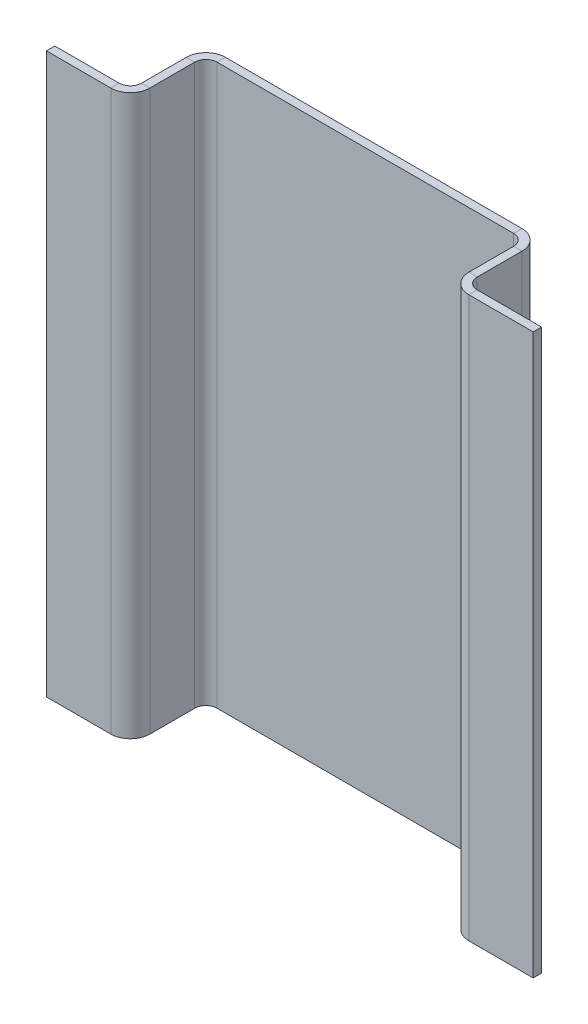
ISO-10303-21;
HEADER;
FILE_DESCRIPTION(('STEP AP214'),'2;1');
FILE_NAME('part.step','',(''),(''),'','','');
FILE_SCHEMA(('AUTOMOTIVE_DESIGN { 1 0 10303 214 1 1 1 1 }'));
ENDSEC;
DATA;
#1=APPLICATION_CONTEXT('core data for automotive mechanical design processes');
#2=APPLICATION_PROTOCOL_DEFINITION('international standard','automotive_design',2000,#1);
#3=PRODUCT_CONTEXT('',#1,'mechanical');
#4=PRODUCT('Part','Part','',(#3));
#5=PRODUCT_RELATED_PRODUCT_CATEGORY('part','',(#4));
#6=PRODUCT_DEFINITION_FORMATION('','',#4);
#7=PRODUCT_DEFINITION_CONTEXT('part definition',#1,'design');
#8=PRODUCT_DEFINITION('design','',#6,#7);
#9=PRODUCT_DEFINITION_SHAPE('','',#8);
#10=(LENGTH_UNIT() NAMED_UNIT(*) SI_UNIT(.MILLI.,.METRE.));
#11=(NAMED_UNIT(*) PLANE_ANGLE_UNIT() SI_UNIT($,.RADIAN.));
#12=(NAMED_UNIT(*) SI_UNIT($,.STERADIAN.) SOLID_ANGLE_UNIT());
#13=UNCERTAINTY_MEASURE_WITH_UNIT(LENGTH_MEASURE(1.E-05),#10,'distance_accuracy_value','');
#14=(GEOMETRIC_REPRESENTATION_CONTEXT(3) GLOBAL_UNCERTAINTY_ASSIGNED_CONTEXT((#13)) GLOBAL_UNIT_ASSIGNED_CONTEXT((#10,
#11,#12)) REPRESENTATION_CONTEXT('',''));
#15=CARTESIAN_POINT('',(0.,0.,0.));
#16=DIRECTION('',(0.,0.,1.));
#17=DIRECTION('',(1.,0.,0.));
#18=AXIS2_PLACEMENT_3D('',#15,#16,#17);
#19=CARTESIAN_POINT('',(30.,50.,13.5));
#20=DIRECTION('',(0.,-1.,0.));
#21=DIRECTION('',(1.,0.,0.));
#22=AXIS2_PLACEMENT_3D('',#19,#20,#21);
#23=PLANE('',#22);
#24=DIRECTION('',(-1.,0.,0.));
#25=VECTOR('',#24,1.);
#26=CARTESIAN_POINT('',(30.,50.,10.));
#27=LINE('',#26,#25);
#28=CARTESIAN_POINT('',(30.,50.,10.));
#29=VERTEX_POINT('',#28);
#30=CARTESIAN_POINT('',(28.5,50.,10.));
#31=VERTEX_POINT('',#30);
#32=EDGE_CURVE('E312',#29,#31,#27,.T.);
#33=ORIENTED_EDGE('',*,*,#32,.F.);
#34=DIRECTION('',(0.,0.,1.));
#35=VECTOR('',#34,1.);
#36=CARTESIAN_POINT('',(30.,50.,-1.13175571624599E-13));
#37=LINE('',#36,#35);
#38=CARTESIAN_POINT('',(30.,50.,1.99999999999999));
#39=VERTEX_POINT('',#38);
#40=EDGE_CURVE('E370',#39,#29,#37,.T.);
#41=ORIENTED_EDGE('',*,*,#40,.F.);
#42=DIRECTION('',(-1.,0.,0.));
#43=VECTOR('',#42,1.);
#44=CARTESIAN_POINT('',(28.5,50.,1.99999999999999));
#45=LINE('',#44,#43);
#46=CARTESIAN_POINT('',(28.5,50.,1.99999999999999));
#47=VERTEX_POINT('',#46);
#48=EDGE_CURVE('E381',#47,#39,#45,.F.);
#49=ORIENTED_EDGE('',*,*,#48,.F.);
#50=DIRECTION('',(0.,0.,-1.));
#51=VECTOR('',#50,1.);
#52=CARTESIAN_POINT('',(28.5,50.,13.5));
#53=LINE('',#52,#51);
#54=EDGE_CURVE('E375',#47,#31,#53,.F.);
#55=ORIENTED_EDGE('',*,*,#54,.T.);
#56=EDGE_LOOP('',(#33,#41,#49,#55));
#57=FACE_BOUND('',#56,.T.);
#58=ADVANCED_FACE('F115',(#57),#23,.F.);
#59=CARTESIAN_POINT('',(30.,-50.,0.));
#60=DIRECTION('',(0.,1.,0.));
#61=DIRECTION('',(-1.,0.,0.));
#62=AXIS2_PLACEMENT_3D('',#59,#60,#61);
#63=PLANE('',#62);
#64=DIRECTION('',(-1.,0.,0.));
#65=VECTOR('',#64,1.);
#66=CARTESIAN_POINT('',(30.,-50.,10.));
#67=LINE('',#66,#65);
#68=CARTESIAN_POINT('',(30.,-50.,10.));
#69=VERTEX_POINT('',#68);
#70=CARTESIAN_POINT('',(28.5,-50.,10.));
#71=VERTEX_POINT('',#70);
#72=EDGE_CURVE('E301',#69,#71,#67,.T.);
#73=ORIENTED_EDGE('',*,*,#72,.T.);
#74=DIRECTION('',(0.,0.,1.));
#75=VECTOR('',#74,1.);
#76=CARTESIAN_POINT('',(28.5,-50.,0.));
#77=LINE('',#76,#75);
#78=CARTESIAN_POINT('',(28.5,-50.,1.99999999999999));
#79=VERTEX_POINT('',#78);
#80=EDGE_CURVE('E373',#71,#79,#77,.F.);
#81=ORIENTED_EDGE('',*,*,#80,.T.);
#82=DIRECTION('',(-1.,0.,0.));
#83=VECTOR('',#82,1.);
#84=CARTESIAN_POINT('',(30.,-50.,1.99999999999999));
#85=LINE('',#84,#83);
#86=CARTESIAN_POINT('',(30.,-50.,1.99999999999999));
#87=VERTEX_POINT('',#86);
#88=EDGE_CURVE('E364',#79,#87,#85,.F.);
#89=ORIENTED_EDGE('',*,*,#88,.T.);
#90=DIRECTION('',(0.,0.,-1.));
#91=VECTOR('',#90,1.);
#92=CARTESIAN_POINT('',(30.,-50.,-1.13175571624599E-13));
#93=LINE('',#92,#91);
#94=EDGE_CURVE('E367',#69,#87,#93,.T.);
#95=ORIENTED_EDGE('',*,*,#94,.F.);
#96=EDGE_LOOP('',(#73,#81,#89,#95));
#97=FACE_BOUND('',#96,.T.);
#98=ADVANCED_FACE('F475',(#97),#63,.F.);
#99=CARTESIAN_POINT('',(30.,0.,-1.13175571624599E-13));
#100=DIRECTION('',(-1.,0.,0.));
#101=DIRECTION('',(0.,0.,1.));
#102=AXIS2_PLACEMENT_3D('',#99,#100,#101);
#103=PLANE('',#102);
#104=DIRECTION('',(0.,-1.,0.));
#105=VECTOR('',#104,1.);
#106=CARTESIAN_POINT('',(30.,-50.,10.));
#107=LINE('',#106,#105);
#108=EDGE_CURVE('E307',#69,#29,#107,.F.);
#109=ORIENTED_EDGE('',*,*,#108,.F.);
#110=ORIENTED_EDGE('',*,*,#94,.T.);
#111=DIRECTION('',(0.,1.,0.));
#112=VECTOR('',#111,1.);
#113=CARTESIAN_POINT('',(30.,-50.,1.99999999999999));
#114=LINE('',#113,#112);
#115=EDGE_CURVE('E378',#39,#87,#114,.F.);
#116=ORIENTED_EDGE('',*,*,#115,.F.);
#117=ORIENTED_EDGE('',*,*,#40,.T.);
#118=EDGE_LOOP('',(#109,#110,#116,#117));
#119=FACE_BOUND('',#118,.T.);
#120=ADVANCED_FACE('F490',(#119),#103,.F.);
#121=CARTESIAN_POINT('',(28.5,0.,-1.07938349616335E-13));
#122=DIRECTION('',(-1.,0.,0.));
#123=DIRECTION('',(0.,0.,1.));
#124=AXIS2_PLACEMENT_3D('',#121,#122,#123);
#125=PLANE('',#124);
#126=ORIENTED_EDGE('',*,*,#80,.F.);
#127=DIRECTION('',(0.,-1.,0.));
#128=VECTOR('',#127,1.);
#129=CARTESIAN_POINT('',(28.5,-50.,10.));
#130=LINE('',#129,#128);
#131=EDGE_CURVE('E296',#71,#31,#130,.F.);
#132=ORIENTED_EDGE('',*,*,#131,.T.);
#133=ORIENTED_EDGE('',*,*,#54,.F.);
#134=DIRECTION('',(0.,1.,0.));
#135=VECTOR('',#134,1.);
#136=CARTESIAN_POINT('',(28.5,-50.,1.99999999999999));
#137=LINE('',#136,#135);
#138=EDGE_CURVE('E384',#79,#47,#137,.T.);
#139=ORIENTED_EDGE('',*,*,#138,.F.);
#140=EDGE_LOOP('',(#126,#132,#133,#139));
#141=FACE_BOUND('',#140,.T.);
#142=ADVANCED_FACE('F478',(#141),#125,.T.);
#143=CARTESIAN_POINT('',(-30.,-50.,13.5));
#144=DIRECTION('',(0.,1.,0.));
#145=DIRECTION('',(-1.,0.,0.));
#146=AXIS2_PLACEMENT_3D('',#143,#144,#145);
#147=PLANE('',#146);
#148=DIRECTION('',(1.,0.,0.));
#149=VECTOR('',#148,1.);
#150=CARTESIAN_POINT('',(-30.,-50.,10.));
#151=LINE('',#150,#149);
#152=CARTESIAN_POINT('',(-30.,-50.,10.));
#153=VERTEX_POINT('',#152);
#154=CARTESIAN_POINT('',(-28.5,-50.,10.));
#155=VERTEX_POINT('',#154);
#156=EDGE_CURVE('E362',#153,#155,#151,.T.);
#157=ORIENTED_EDGE('',*,*,#156,.F.);
#158=DIRECTION('',(0.,0.,1.));
#159=VECTOR('',#158,1.);
#160=CARTESIAN_POINT('',(-30.,-50.,-1.13175571624599E-13));
#161=LINE('',#160,#159);
#162=CARTESIAN_POINT('',(-30.,-50.,1.99999999999999));
#163=VERTEX_POINT('',#162);
#164=EDGE_CURVE('E414',#163,#153,#161,.T.);
#165=ORIENTED_EDGE('',*,*,#164,.F.);
#166=DIRECTION('',(1.,0.,0.));
#167=VECTOR('',#166,1.);
#168=CARTESIAN_POINT('',(-28.5,-50.,1.99999999999999));
#169=LINE('',#168,#167);
#170=CARTESIAN_POINT('',(-28.5,-50.,1.99999999999999));
#171=VERTEX_POINT('',#170);
#172=EDGE_CURVE('E425',#171,#163,#169,.F.);
#173=ORIENTED_EDGE('',*,*,#172,.F.);
#174=DIRECTION('',(0.,0.,-1.));
#175=VECTOR('',#174,1.);
#176=CARTESIAN_POINT('',(-28.5,-50.,13.5));
#177=LINE('',#176,#175);
#178=EDGE_CURVE('E419',#171,#155,#177,.F.);
#179=ORIENTED_EDGE('',*,*,#178,.T.);
#180=EDGE_LOOP('',(#157,#165,#173,#179));
#181=FACE_BOUND('',#180,.T.);
#182=ADVANCED_FACE('F514',(#181),#147,.F.);
#183=CARTESIAN_POINT('',(-30.,50.,0.));
#184=DIRECTION('',(0.,-1.,0.));
#185=DIRECTION('',(1.,0.,0.));
#186=AXIS2_PLACEMENT_3D('',#183,#184,#185);
#187=PLANE('',#186);
#188=DIRECTION('',(1.,0.,0.));
#189=VECTOR('',#188,1.);
#190=CARTESIAN_POINT('',(-30.,50.,10.));
#191=LINE('',#190,#189);
#192=CARTESIAN_POINT('',(-30.,50.,10.));
#193=VERTEX_POINT('',#192);
#194=CARTESIAN_POINT('',(-28.5,50.,10.));
#195=VERTEX_POINT('',#194);
#196=EDGE_CURVE('E352',#193,#195,#191,.T.);
#197=ORIENTED_EDGE('',*,*,#196,.T.);
#198=DIRECTION('',(0.,0.,1.));
#199=VECTOR('',#198,1.);
#200=CARTESIAN_POINT('',(-28.5,50.,0.));
#201=LINE('',#200,#199);
#202=CARTESIAN_POINT('',(-28.5,50.,1.99999999999999));
#203=VERTEX_POINT('',#202);
#204=EDGE_CURVE('E417',#195,#203,#201,.F.);
#205=ORIENTED_EDGE('',*,*,#204,.T.);
#206=DIRECTION('',(1.,0.,0.));
#207=VECTOR('',#206,1.);
#208=CARTESIAN_POINT('',(-30.,50.,1.99999999999999));
#209=LINE('',#208,#207);
#210=CARTESIAN_POINT('',(-30.,50.,1.99999999999999));
#211=VERTEX_POINT('',#210);
#212=EDGE_CURVE('E408',#203,#211,#209,.F.);
#213=ORIENTED_EDGE('',*,*,#212,.T.);
#214=DIRECTION('',(0.,0.,-1.));
#215=VECTOR('',#214,1.);
#216=CARTESIAN_POINT('',(-30.,50.,-1.13175571624599E-13));
#217=LINE('',#216,#215);
#218=EDGE_CURVE('E411',#193,#211,#217,.T.);
#219=ORIENTED_EDGE('',*,*,#218,.F.);
#220=EDGE_LOOP('',(#197,#205,#213,#219));
#221=FACE_BOUND('',#220,.T.);
#222=ADVANCED_FACE('F529',(#221),#187,.F.);
#223=CARTESIAN_POINT('',(-30.,0.,-1.13175571624599E-13));
#224=DIRECTION('',(1.,0.,0.));
#225=DIRECTION('',(0.,0.,-1.));
#226=AXIS2_PLACEMENT_3D('',#223,#224,#225);
#227=PLANE('',#226);
#228=DIRECTION('',(0.,1.,0.));
#229=VECTOR('',#228,1.);
#230=CARTESIAN_POINT('',(-30.,50.,10.));
#231=LINE('',#230,#229);
#232=EDGE_CURVE('E358',#193,#153,#231,.F.);
#233=ORIENTED_EDGE('',*,*,#232,.F.);
#234=ORIENTED_EDGE('',*,*,#218,.T.);
#235=DIRECTION('',(0.,-1.,0.));
#236=VECTOR('',#235,1.);
#237=CARTESIAN_POINT('',(-30.,50.,1.99999999999999));
#238=LINE('',#237,#236);
#239=EDGE_CURVE('E422',#163,#211,#238,.F.);
#240=ORIENTED_EDGE('',*,*,#239,.F.);
#241=ORIENTED_EDGE('',*,*,#164,.T.);
#242=EDGE_LOOP('',(#233,#234,#240,#241));
#243=FACE_BOUND('',#242,.T.);
#244=ADVANCED_FACE('F511',(#243),#227,.F.);
#245=CARTESIAN_POINT('',(-28.5,0.,-1.07938349616335E-13));
#246=DIRECTION('',(1.,0.,0.));
#247=DIRECTION('',(0.,0.,-1.));
#248=AXIS2_PLACEMENT_3D('',#245,#246,#247);
#249=PLANE('',#248);
#250=ORIENTED_EDGE('',*,*,#204,.F.);
#251=DIRECTION('',(0.,1.,0.));
#252=VECTOR('',#251,1.);
#253=CARTESIAN_POINT('',(-28.5,50.,10.));
#254=LINE('',#253,#252);
#255=EDGE_CURVE('E347',#195,#155,#254,.F.);
#256=ORIENTED_EDGE('',*,*,#255,.T.);
#257=ORIENTED_EDGE('',*,*,#178,.F.);
#258=DIRECTION('',(0.,-1.,0.));
#259=VECTOR('',#258,1.);
#260=CARTESIAN_POINT('',(-28.5,50.,1.99999999999999));
#261=LINE('',#260,#259);
#262=EDGE_CURVE('E428',#203,#171,#261,.T.);
#263=ORIENTED_EDGE('',*,*,#262,.F.);
#264=EDGE_LOOP('',(#250,#256,#257,#263));
#265=FACE_BOUND('',#264,.T.);
#266=ADVANCED_FACE('F520',(#265),#249,.T.);
#267=CARTESIAN_POINT('',(0.,0.,-1.5));
#268=DIRECTION('',(0.,0.,1.));
#269=DIRECTION('',(1.,0.,0.));
#270=AXIS2_PLACEMENT_3D('',#267,#268,#269);
#271=PLANE('',#270);
#272=DIRECTION('',(0.,1.,0.));
#273=VECTOR('',#272,1.);
#274=CARTESIAN_POINT('',(26.5,50.,-1.50000000000001));
#275=LINE('',#274,#273);
#276=CARTESIAN_POINT('',(26.5,50.,-1.50000000000001));
#277=VERTEX_POINT('',#276);
#278=CARTESIAN_POINT('',(26.5,-50.,-1.5));
#279=VERTEX_POINT('',#278);
#280=EDGE_CURVE('E388',#277,#279,#275,.F.);
#281=ORIENTED_EDGE('',*,*,#280,.T.);
#282=DIRECTION('',(1.,0.,0.));
#283=VECTOR('',#282,1.);
#284=CARTESIAN_POINT('',(-30.,-50.,-1.5));
#285=LINE('',#284,#283);
#286=CARTESIAN_POINT('',(-26.5,-50.,-1.50000000000001));
#287=VERTEX_POINT('',#286);
#288=EDGE_CURVE('E13',#287,#279,#285,.T.);
#289=ORIENTED_EDGE('',*,*,#288,.F.);
#290=DIRECTION('',(0.,-1.,0.));
#291=VECTOR('',#290,1.);
#292=CARTESIAN_POINT('',(-26.5,-50.,-1.50000000000001));
#293=LINE('',#292,#291);
#294=CARTESIAN_POINT('',(-26.5,50.,-1.5));
#295=VERTEX_POINT('',#294);
#296=EDGE_CURVE('E432',#287,#295,#293,.F.);
#297=ORIENTED_EDGE('',*,*,#296,.T.);
#298=DIRECTION('',(-1.,0.,0.));
#299=VECTOR('',#298,1.);
#300=CARTESIAN_POINT('',(-30.,50.,-1.5));
#301=LINE('',#300,#299);
#302=EDGE_CURVE('E124',#277,#295,#301,.T.);
#303=ORIENTED_EDGE('',*,*,#302,.F.);
#304=EDGE_LOOP('',(#281,#289,#297,#303));
#305=FACE_BOUND('',#304,.T.);
#306=ADVANCED_FACE('F495',(#305),#271,.F.);
#307=CARTESIAN_POINT('',(0.,0.,0.));
#308=DIRECTION('',(0.,0.,1.));
#309=DIRECTION('',(1.,0.,0.));
#310=AXIS2_PLACEMENT_3D('',#307,#308,#309);
#311=PLANE('',#310);
#312=DIRECTION('',(1.,0.,0.));
#313=VECTOR('',#312,1.);
#314=CARTESIAN_POINT('',(-30.,-50.,0.));
#315=LINE('',#314,#313);
#316=CARTESIAN_POINT('',(-26.5,-50.,0.));
#317=VERTEX_POINT('',#316);
#318=CARTESIAN_POINT('',(26.5,-50.,0.));
#319=VERTEX_POINT('',#318);
#320=EDGE_CURVE('E119',#317,#319,#315,.T.);
#321=ORIENTED_EDGE('',*,*,#320,.T.);
#322=DIRECTION('',(0.,1.,0.));
#323=VECTOR('',#322,1.);
#324=CARTESIAN_POINT('',(26.5,50.,0.));
#325=LINE('',#324,#323);
#326=CARTESIAN_POINT('',(26.5,50.,0.));
#327=VERTEX_POINT('',#326);
#328=EDGE_CURVE('E400',#327,#319,#325,.F.);
#329=ORIENTED_EDGE('',*,*,#328,.F.);
#330=DIRECTION('',(-1.,0.,0.));
#331=VECTOR('',#330,1.);
#332=CARTESIAN_POINT('',(-30.,50.,0.));
#333=LINE('',#332,#331);
#334=CARTESIAN_POINT('',(-26.5,50.,0.));
#335=VERTEX_POINT('',#334);
#336=EDGE_CURVE('E453',#327,#335,#333,.T.);
#337=ORIENTED_EDGE('',*,*,#336,.T.);
#338=DIRECTION('',(0.,-1.,0.));
#339=VECTOR('',#338,1.);
#340=CARTESIAN_POINT('',(-26.5,-50.,0.));
#341=LINE('',#340,#339);
#342=EDGE_CURVE('E445',#317,#335,#341,.F.);
#343=ORIENTED_EDGE('',*,*,#342,.F.);
#344=EDGE_LOOP('',(#321,#329,#337,#343));
#345=FACE_BOUND('',#344,.T.);
#346=ADVANCED_FACE('F461',(#345),#311,.T.);
#347=CARTESIAN_POINT('',(-30.,50.,-1.5));
#348=DIRECTION('',(0.,1.,0.));
#349=DIRECTION('',(0.,0.,1.));
#350=AXIS2_PLACEMENT_3D('',#347,#348,#349);
#351=PLANE('',#350);
#352=ORIENTED_EDGE('',*,*,#336,.F.);
#353=DIRECTION('',(0.,0.,-1.));
#354=VECTOR('',#353,1.);
#355=CARTESIAN_POINT('',(26.5,50.,0.));
#356=LINE('',#355,#354);
#357=EDGE_CURVE('E394',#327,#277,#356,.T.);
#358=ORIENTED_EDGE('',*,*,#357,.T.);
#359=ORIENTED_EDGE('',*,*,#302,.T.);
#360=DIRECTION('',(0.,0.,-1.));
#361=VECTOR('',#360,1.);
#362=CARTESIAN_POINT('',(-26.5,50.,0.));
#363=LINE('',#362,#361);
#364=EDGE_CURVE('E450',#335,#295,#363,.T.);
#365=ORIENTED_EDGE('',*,*,#364,.F.);
#366=EDGE_LOOP('',(#352,#358,#359,#365));
#367=FACE_BOUND('',#366,.T.);
#368=ADVANCED_FACE('F117',(#367),#351,.T.);
#369=CARTESIAN_POINT('',(-30.,-50.,-1.5));
#370=DIRECTION('',(0.,-1.,0.));
#371=DIRECTION('',(0.,0.,-1.));
#372=AXIS2_PLACEMENT_3D('',#369,#370,#371);
#373=PLANE('',#372);
#374=DIRECTION('',(0.,0.,-1.));
#375=VECTOR('',#374,1.);
#376=CARTESIAN_POINT('',(26.5,-50.,0.));
#377=LINE('',#376,#375);
#378=EDGE_CURVE('E405',#319,#279,#377,.T.);
#379=ORIENTED_EDGE('',*,*,#378,.F.);
#380=ORIENTED_EDGE('',*,*,#320,.F.);
#381=DIRECTION('',(0.,0.,-1.));
#382=VECTOR('',#381,1.);
#383=CARTESIAN_POINT('',(-26.5,-50.,0.));
#384=LINE('',#383,#382);
#385=EDGE_CURVE('E439',#317,#287,#384,.T.);
#386=ORIENTED_EDGE('',*,*,#385,.T.);
#387=ORIENTED_EDGE('',*,*,#288,.T.);
#388=EDGE_LOOP('',(#379,#380,#386,#387));
#389=FACE_BOUND('',#388,.T.);
#390=ADVANCED_FACE('F496',(#389),#373,.T.);
#391=CARTESIAN_POINT('',(-26.5,50.,2.));
#392=DIRECTION('',(0.,1.,0.));
#393=DIRECTION('',(0.,0.,1.));
#394=AXIS2_PLACEMENT_3D('',#391,#392,#393);
#395=PLANE('',#394);
#396=ORIENTED_EDGE('',*,*,#212,.F.);
#397=CARTESIAN_POINT('',(-26.5,50.,2.));
#398=DIRECTION('',(0.,-1.,0.));
#399=DIRECTION('',(0.,0.,-1.));
#400=AXIS2_PLACEMENT_3D('',#397,#398,#399);
#401=CIRCLE('',#400,2.00000000000001);
#402=EDGE_CURVE('E442',#335,#203,#401,.F.);
#403=ORIENTED_EDGE('',*,*,#402,.F.);
#404=ORIENTED_EDGE('',*,*,#364,.T.);
#405=CARTESIAN_POINT('',(-26.5,50.,2.));
#406=DIRECTION('',(0.,-1.,0.));
#407=DIRECTION('',(0.,0.,-1.));
#408=AXIS2_PLACEMENT_3D('',#405,#406,#407);
#409=CIRCLE('',#408,3.50000000000001);
#410=EDGE_CURVE('E435',#295,#211,#409,.F.);
#411=ORIENTED_EDGE('',*,*,#410,.T.);
#412=EDGE_LOOP('',(#396,#403,#404,#411));
#413=FACE_BOUND('',#412,.T.);
#414=ADVANCED_FACE('F533',(#413),#395,.T.);
#415=CARTESIAN_POINT('',(-26.5,-50.,2.));
#416=DIRECTION('',(0.,1.,0.));
#417=DIRECTION('',(0.,0.,1.));
#418=AXIS2_PLACEMENT_3D('',#415,#416,#417);
#419=PLANE('',#418);
#420=CARTESIAN_POINT('',(-26.5,-50.,2.));
#421=DIRECTION('',(0.,-1.,0.));
#422=DIRECTION('',(0.,0.,-1.));
#423=AXIS2_PLACEMENT_3D('',#420,#421,#422);
#424=CIRCLE('',#423,2.00000000000001);
#425=EDGE_CURVE('E413',#171,#317,#424,.T.);
#426=ORIENTED_EDGE('',*,*,#425,.F.);
#427=ORIENTED_EDGE('',*,*,#172,.T.);
#428=CARTESIAN_POINT('',(-26.5,-50.,2.));
#429=DIRECTION('',(0.,-1.,0.));
#430=DIRECTION('',(0.,0.,-1.));
#431=AXIS2_PLACEMENT_3D('',#428,#429,#430);
#432=CIRCLE('',#431,3.50000000000001);
#433=EDGE_CURVE('E436',#163,#287,#432,.T.);
#434=ORIENTED_EDGE('',*,*,#433,.T.);
#435=ORIENTED_EDGE('',*,*,#385,.F.);
#436=EDGE_LOOP('',(#426,#427,#434,#435));
#437=FACE_BOUND('',#436,.T.);
#438=ADVANCED_FACE('F503',(#437),#419,.F.);
#439=CARTESIAN_POINT('',(-26.5,-50.,2.));
#440=DIRECTION('',(0.,-1.,0.));
#441=DIRECTION('',(-1.,0.,0.));
#442=AXIS2_PLACEMENT_3D('',#439,#440,#441);
#443=CYLINDRICAL_SURFACE('',#442,3.50000000000001);
#444=ORIENTED_EDGE('',*,*,#296,.F.);
#445=ORIENTED_EDGE('',*,*,#433,.F.);
#446=ORIENTED_EDGE('',*,*,#239,.T.);
#447=ORIENTED_EDGE('',*,*,#410,.F.);
#448=EDGE_LOOP('',(#444,#445,#446,#447));
#449=FACE_BOUND('',#448,.T.);
#450=ADVANCED_FACE('F502',(#449),#443,.T.);
#451=CARTESIAN_POINT('',(-26.5,-50.,2.));
#452=DIRECTION('',(0.,-1.,0.));
#453=DIRECTION('',(-1.,0.,0.));
#454=AXIS2_PLACEMENT_3D('',#451,#452,#453);
#455=CYLINDRICAL_SURFACE('',#454,2.00000000000001);
#456=ORIENTED_EDGE('',*,*,#342,.T.);
#457=ORIENTED_EDGE('',*,*,#402,.T.);
#458=ORIENTED_EDGE('',*,*,#262,.T.);
#459=ORIENTED_EDGE('',*,*,#425,.T.);
#460=EDGE_LOOP('',(#456,#457,#458,#459));
#461=FACE_BOUND('',#460,.T.);
#462=ADVANCED_FACE('F535',(#461),#455,.F.);
#463=CARTESIAN_POINT('',(26.5,-50.,2.));
#464=DIRECTION('',(0.,-1.,0.));
#465=DIRECTION('',(0.,0.,-1.));
#466=AXIS2_PLACEMENT_3D('',#463,#464,#465);
#467=PLANE('',#466);
#468=ORIENTED_EDGE('',*,*,#88,.F.);
#469=CARTESIAN_POINT('',(26.5,-50.,2.));
#470=DIRECTION('',(0.,1.,0.));
#471=DIRECTION('',(0.,0.,1.));
#472=AXIS2_PLACEMENT_3D('',#469,#470,#471);
#473=CIRCLE('',#472,2.00000000000001);
#474=EDGE_CURVE('E397',#319,#79,#473,.F.);
#475=ORIENTED_EDGE('',*,*,#474,.F.);
#476=ORIENTED_EDGE('',*,*,#378,.T.);
#477=CARTESIAN_POINT('',(26.5,-50.,2.));
#478=DIRECTION('',(0.,1.,0.));
#479=DIRECTION('',(0.,0.,1.));
#480=AXIS2_PLACEMENT_3D('',#477,#478,#479);
#481=CIRCLE('',#480,3.50000000000001);
#482=EDGE_CURVE('E390',#279,#87,#481,.F.);
#483=ORIENTED_EDGE('',*,*,#482,.T.);
#484=EDGE_LOOP('',(#468,#475,#476,#483));
#485=FACE_BOUND('',#484,.T.);
#486=ADVANCED_FACE('F471',(#485),#467,.T.);
#487=CARTESIAN_POINT('',(26.5,50.,2.));
#488=DIRECTION('',(0.,-1.,0.));
#489=DIRECTION('',(0.,0.,-1.));
#490=AXIS2_PLACEMENT_3D('',#487,#488,#489);
#491=PLANE('',#490);
#492=CARTESIAN_POINT('',(26.5,50.,2.));
#493=DIRECTION('',(0.,1.,0.));
#494=DIRECTION('',(0.,0.,1.));
#495=AXIS2_PLACEMENT_3D('',#492,#493,#494);
#496=CIRCLE('',#495,2.00000000000001);
#497=EDGE_CURVE('E369',#47,#327,#496,.T.);
#498=ORIENTED_EDGE('',*,*,#497,.F.);
#499=ORIENTED_EDGE('',*,*,#48,.T.);
#500=CARTESIAN_POINT('',(26.5,50.,2.));
#501=DIRECTION('',(0.,1.,0.));
#502=DIRECTION('',(0.,0.,1.));
#503=AXIS2_PLACEMENT_3D('',#500,#501,#502);
#504=CIRCLE('',#503,3.50000000000001);
#505=EDGE_CURVE('E391',#39,#277,#504,.T.);
#506=ORIENTED_EDGE('',*,*,#505,.T.);
#507=ORIENTED_EDGE('',*,*,#357,.F.);
#508=EDGE_LOOP('',(#498,#499,#506,#507));
#509=FACE_BOUND('',#508,.T.);
#510=ADVANCED_FACE('F483',(#509),#491,.F.);
#511=CARTESIAN_POINT('',(26.5,50.,2.));
#512=DIRECTION('',(0.,1.,0.));
#513=DIRECTION('',(1.,0.,0.));
#514=AXIS2_PLACEMENT_3D('',#511,#512,#513);
#515=CYLINDRICAL_SURFACE('',#514,3.50000000000001);
#516=ORIENTED_EDGE('',*,*,#280,.F.);
#517=ORIENTED_EDGE('',*,*,#505,.F.);
#518=ORIENTED_EDGE('',*,*,#115,.T.);
#519=ORIENTED_EDGE('',*,*,#482,.F.);
#520=EDGE_LOOP('',(#516,#517,#518,#519));
#521=FACE_BOUND('',#520,.T.);
#522=ADVANCED_FACE('F493',(#521),#515,.T.);
#523=CARTESIAN_POINT('',(26.5,50.,2.));
#524=DIRECTION('',(0.,1.,0.));
#525=DIRECTION('',(1.,0.,0.));
#526=AXIS2_PLACEMENT_3D('',#523,#524,#525);
#527=CYLINDRICAL_SURFACE('',#526,2.00000000000001);
#528=ORIENTED_EDGE('',*,*,#328,.T.);
#529=ORIENTED_EDGE('',*,*,#474,.T.);
#530=ORIENTED_EDGE('',*,*,#138,.T.);
#531=ORIENTED_EDGE('',*,*,#497,.T.);
#532=EDGE_LOOP('',(#528,#529,#530,#531));
#533=FACE_BOUND('',#532,.T.);
#534=ADVANCED_FACE('F466',(#533),#527,.F.);
#535=CARTESIAN_POINT('',(-32.,-50.,10.));
#536=DIRECTION('',(0.,-1.,0.));
#537=DIRECTION('',(0.,0.,-1.));
#538=AXIS2_PLACEMENT_3D('',#535,#536,#537);
#539=PLANE('',#538);
#540=DIRECTION('',(0.,0.,-1.));
#541=VECTOR('',#540,1.);
#542=CARTESIAN_POINT('',(-32.,-50.,13.5));
#543=LINE('',#542,#541);
#544=CARTESIAN_POINT('',(-32.,-50.,12.));
#545=VERTEX_POINT('',#544);
#546=CARTESIAN_POINT('',(-32.,-50.,13.5));
#547=VERTEX_POINT('',#546);
#548=EDGE_CURVE('E314',#545,#547,#543,.F.);
#549=ORIENTED_EDGE('',*,*,#548,.F.);
#550=CARTESIAN_POINT('',(-32.,-50.,10.));
#551=DIRECTION('',(0.,1.,0.));
#552=DIRECTION('',(0.,0.,1.));
#553=AXIS2_PLACEMENT_3D('',#550,#551,#552);
#554=CIRCLE('',#553,2.);
#555=EDGE_CURVE('E355',#153,#545,#554,.F.);
#556=ORIENTED_EDGE('',*,*,#555,.F.);
#557=ORIENTED_EDGE('',*,*,#156,.T.);
#558=CARTESIAN_POINT('',(-32.,-50.,10.));
#559=DIRECTION('',(0.,1.,0.));
#560=DIRECTION('',(0.,0.,1.));
#561=AXIS2_PLACEMENT_3D('',#558,#559,#560);
#562=CIRCLE('',#561,3.5);
#563=EDGE_CURVE('E140',#155,#547,#562,.F.);
#564=ORIENTED_EDGE('',*,*,#563,.T.);
#565=EDGE_LOOP('',(#549,#556,#557,#564));
#566=FACE_BOUND('',#565,.T.);
#567=ADVANCED_FACE('F517',(#566),#539,.T.);
#568=CARTESIAN_POINT('',(-32.,50.,10.));
#569=DIRECTION('',(0.,-1.,0.));
#570=DIRECTION('',(0.,0.,-1.));
#571=AXIS2_PLACEMENT_3D('',#568,#569,#570);
#572=PLANE('',#571);
#573=CARTESIAN_POINT('',(-32.,50.,10.));
#574=DIRECTION('',(0.,1.,0.));
#575=DIRECTION('',(0.,0.,1.));
#576=AXIS2_PLACEMENT_3D('',#573,#574,#575);
#577=CIRCLE('',#576,2.);
#578=CARTESIAN_POINT('',(-32.,50.,12.));
#579=VERTEX_POINT('',#578);
#580=EDGE_CURVE('E320',#579,#193,#577,.T.);
#581=ORIENTED_EDGE('',*,*,#580,.F.);
#582=DIRECTION('',(0.,0.,-1.));
#583=VECTOR('',#582,1.);
#584=CARTESIAN_POINT('',(-32.,50.,12.));
#585=LINE('',#584,#583);
#586=CARTESIAN_POINT('',(-32.,50.,13.5));
#587=VERTEX_POINT('',#586);
#588=EDGE_CURVE('E340',#579,#587,#585,.F.);
#589=ORIENTED_EDGE('',*,*,#588,.T.);
#590=CARTESIAN_POINT('',(-32.,50.,10.));
#591=DIRECTION('',(0.,1.,0.));
#592=DIRECTION('',(0.,0.,1.));
#593=AXIS2_PLACEMENT_3D('',#590,#591,#592);
#594=CIRCLE('',#593,3.5);
#595=EDGE_CURVE('E350',#587,#195,#594,.T.);
#596=ORIENTED_EDGE('',*,*,#595,.T.);
#597=ORIENTED_EDGE('',*,*,#196,.F.);
#598=EDGE_LOOP('',(#581,#589,#596,#597));
#599=FACE_BOUND('',#598,.T.);
#600=ADVANCED_FACE('F525',(#599),#572,.F.);
#601=CARTESIAN_POINT('',(-32.,50.,10.));
#602=DIRECTION('',(0.,1.,0.));
#603=DIRECTION('',(0.,0.,1.));
#604=AXIS2_PLACEMENT_3D('',#601,#602,#603);
#605=CYLINDRICAL_SURFACE('',#604,3.5);
#606=ORIENTED_EDGE('',*,*,#255,.F.);
#607=ORIENTED_EDGE('',*,*,#595,.F.);
#608=DIRECTION('',(0.,1.,0.));
#609=VECTOR('',#608,1.);
#610=CARTESIAN_POINT('',(-32.,-50.,13.5));
#611=LINE('',#610,#609);
#612=EDGE_CURVE('E338',#587,#547,#611,.F.);
#613=ORIENTED_EDGE('',*,*,#612,.T.);
#614=ORIENTED_EDGE('',*,*,#563,.F.);
#615=EDGE_LOOP('',(#606,#607,#613,#614));
#616=FACE_BOUND('',#615,.T.);
#617=ADVANCED_FACE('F522',(#616),#605,.T.);
#618=CARTESIAN_POINT('',(-32.,50.,10.));
#619=DIRECTION('',(0.,1.,0.));
#620=DIRECTION('',(0.,0.,1.));
#621=AXIS2_PLACEMENT_3D('',#618,#619,#620);
#622=CYLINDRICAL_SURFACE('',#621,2.);
#623=ORIENTED_EDGE('',*,*,#232,.T.);
#624=ORIENTED_EDGE('',*,*,#555,.T.);
#625=DIRECTION('',(0.,1.,0.));
#626=VECTOR('',#625,1.);
#627=CARTESIAN_POINT('',(-32.,-50.,12.));
#628=LINE('',#627,#626);
#629=EDGE_CURVE('E343',#545,#579,#628,.T.);
#630=ORIENTED_EDGE('',*,*,#629,.T.);
#631=ORIENTED_EDGE('',*,*,#580,.T.);
#632=EDGE_LOOP('',(#623,#624,#630,#631));
#633=FACE_BOUND('',#632,.T.);
#634=ADVANCED_FACE('F578',(#633),#622,.F.);
#635=CARTESIAN_POINT('',(-43.5,50.,13.5));
#636=DIRECTION('',(0.,-1.,0.));
#637=DIRECTION('',(0.,0.,-1.));
#638=AXIS2_PLACEMENT_3D('',#635,#636,#637);
#639=PLANE('',#638);
#640=ORIENTED_EDGE('',*,*,#588,.F.);
#641=DIRECTION('',(1.,0.,0.));
#642=VECTOR('',#641,1.);
#643=CARTESIAN_POINT('',(-43.5,50.,12.));
#644=LINE('',#643,#642);
#645=CARTESIAN_POINT('',(-43.5,50.,12.));
#646=VERTEX_POINT('',#645);
#647=EDGE_CURVE('E336',#579,#646,#644,.F.);
#648=ORIENTED_EDGE('',*,*,#647,.T.);
#649=DIRECTION('',(0.,0.,-1.));
#650=VECTOR('',#649,1.);
#651=CARTESIAN_POINT('',(-43.5,50.,13.5));
#652=LINE('',#651,#650);
#653=CARTESIAN_POINT('',(-43.5,50.,13.5));
#654=VERTEX_POINT('',#653);
#655=EDGE_CURVE('E317',#654,#646,#652,.T.);
#656=ORIENTED_EDGE('',*,*,#655,.F.);
#657=DIRECTION('',(-1.,0.,0.));
#658=VECTOR('',#657,1.);
#659=CARTESIAN_POINT('',(0.,50.,13.5));
#660=LINE('',#659,#658);
#661=EDGE_CURVE('E329',#587,#654,#660,.T.);
#662=ORIENTED_EDGE('',*,*,#661,.F.);
#663=EDGE_LOOP('',(#640,#648,#656,#662));
#664=FACE_BOUND('',#663,.T.);
#665=ADVANCED_FACE('F581',(#664),#639,.F.);
#666=CARTESIAN_POINT('',(-30.,-50.,13.5));
#667=DIRECTION('',(0.,1.,0.));
#668=DIRECTION('',(0.,0.,1.));
#669=AXIS2_PLACEMENT_3D('',#666,#667,#668);
#670=PLANE('',#669);
#671=ORIENTED_EDGE('',*,*,#548,.T.);
#672=DIRECTION('',(1.,0.,0.));
#673=VECTOR('',#672,1.);
#674=CARTESIAN_POINT('',(0.,-50.,13.5));
#675=LINE('',#674,#673);
#676=CARTESIAN_POINT('',(-43.5,-50.,13.5));
#677=VERTEX_POINT('',#676);
#678=EDGE_CURVE('E324',#677,#547,#675,.T.);
#679=ORIENTED_EDGE('',*,*,#678,.F.);
#680=DIRECTION('',(0.,0.,-1.));
#681=VECTOR('',#680,1.);
#682=CARTESIAN_POINT('',(-43.5,-50.,13.5));
#683=LINE('',#682,#681);
#684=CARTESIAN_POINT('',(-43.5,-50.,12.));
#685=VERTEX_POINT('',#684);
#686=EDGE_CURVE('E321',#677,#685,#683,.T.);
#687=ORIENTED_EDGE('',*,*,#686,.T.);
#688=DIRECTION('',(-1.,0.,0.));
#689=VECTOR('',#688,1.);
#690=CARTESIAN_POINT('',(-30.,-50.,12.));
#691=LINE('',#690,#689);
#692=EDGE_CURVE('E331',#685,#545,#691,.F.);
#693=ORIENTED_EDGE('',*,*,#692,.T.);
#694=EDGE_LOOP('',(#671,#679,#687,#693));
#695=FACE_BOUND('',#694,.T.);
#696=ADVANCED_FACE('F587',(#695),#670,.F.);
#697=CARTESIAN_POINT('',(0.,0.,13.5));
#698=DIRECTION('',(0.,0.,-1.));
#699=DIRECTION('',(-1.,0.,0.));
#700=AXIS2_PLACEMENT_3D('',#697,#698,#699);
#701=PLANE('',#700);
#702=ORIENTED_EDGE('',*,*,#612,.F.);
#703=ORIENTED_EDGE('',*,*,#661,.T.);
#704=DIRECTION('',(0.,-1.,0.));
#705=VECTOR('',#704,1.);
#706=CARTESIAN_POINT('',(-43.5,0.,13.5));
#707=LINE('',#706,#705);
#708=EDGE_CURVE('E327',#654,#677,#707,.T.);
#709=ORIENTED_EDGE('',*,*,#708,.T.);
#710=ORIENTED_EDGE('',*,*,#678,.T.);
#711=EDGE_LOOP('',(#702,#703,#709,#710));
#712=FACE_BOUND('',#711,.T.);
#713=ADVANCED_FACE('F597',(#712),#701,.F.);
#714=CARTESIAN_POINT('',(0.,0.,12.));
#715=DIRECTION('',(0.,0.,-1.));
#716=DIRECTION('',(-1.,0.,0.));
#717=AXIS2_PLACEMENT_3D('',#714,#715,#716);
#718=PLANE('',#717);
#719=ORIENTED_EDGE('',*,*,#647,.F.);
#720=ORIENTED_EDGE('',*,*,#629,.F.);
#721=ORIENTED_EDGE('',*,*,#692,.F.);
#722=DIRECTION('',(0.,1.,0.));
#723=VECTOR('',#722,1.);
#724=CARTESIAN_POINT('',(-43.5,-50.,12.));
#725=LINE('',#724,#723);
#726=EDGE_CURVE('E334',#646,#685,#725,.F.);
#727=ORIENTED_EDGE('',*,*,#726,.F.);
#728=EDGE_LOOP('',(#719,#720,#721,#727));
#729=FACE_BOUND('',#728,.T.);
#730=ADVANCED_FACE('F593',(#729),#718,.T.);
#731=CARTESIAN_POINT('',(-43.5,-50.,13.5));
#732=DIRECTION('',(1.,0.,0.));
#733=DIRECTION('',(0.,1.,0.));
#734=AXIS2_PLACEMENT_3D('',#731,#732,#733);
#735=PLANE('',#734);
#736=ORIENTED_EDGE('',*,*,#726,.T.);
#737=ORIENTED_EDGE('',*,*,#686,.F.);
#738=ORIENTED_EDGE('',*,*,#708,.F.);
#739=ORIENTED_EDGE('',*,*,#655,.T.);
#740=EDGE_LOOP('',(#736,#737,#738,#739));
#741=FACE_BOUND('',#740,.T.);
#742=ADVANCED_FACE('F589',(#741),#735,.F.);
#743=CARTESIAN_POINT('',(32.,50.,10.));
#744=DIRECTION('',(0.,1.,0.));
#745=DIRECTION('',(0.,0.,1.));
#746=AXIS2_PLACEMENT_3D('',#743,#744,#745);
#747=PLANE('',#746);
#748=DIRECTION('',(0.,0.,-1.));
#749=VECTOR('',#748,1.);
#750=CARTESIAN_POINT('',(32.,50.,13.5));
#751=LINE('',#750,#749);
#752=CARTESIAN_POINT('',(32.,50.,12.));
#753=VERTEX_POINT('',#752);
#754=CARTESIAN_POINT('',(32.,50.,13.5));
#755=VERTEX_POINT('',#754);
#756=EDGE_CURVE('E278',#753,#755,#751,.F.);
#757=ORIENTED_EDGE('',*,*,#756,.F.);
#758=CARTESIAN_POINT('',(32.,50.,10.));
#759=DIRECTION('',(0.,-1.,0.));
#760=DIRECTION('',(0.,0.,-1.));
#761=AXIS2_PLACEMENT_3D('',#758,#759,#760);
#762=CIRCLE('',#761,2.);
#763=EDGE_CURVE('E304',#29,#753,#762,.F.);
#764=ORIENTED_EDGE('',*,*,#763,.F.);
#765=ORIENTED_EDGE('',*,*,#32,.T.);
#766=CARTESIAN_POINT('',(32.,50.,10.));
#767=DIRECTION('',(0.,-1.,0.));
#768=DIRECTION('',(0.,0.,-1.));
#769=AXIS2_PLACEMENT_3D('',#766,#767,#768);
#770=CIRCLE('',#769,3.5);
#771=EDGE_CURVE('E132',#31,#755,#770,.F.);
#772=ORIENTED_EDGE('',*,*,#771,.T.);
#773=EDGE_LOOP('',(#757,#764,#765,#772));
#774=FACE_BOUND('',#773,.T.);
#775=ADVANCED_FACE('F592',(#774),#747,.T.);
#776=CARTESIAN_POINT('',(32.,-50.,10.));
#777=DIRECTION('',(0.,1.,0.));
#778=DIRECTION('',(0.,0.,1.));
#779=AXIS2_PLACEMENT_3D('',#776,#777,#778);
#780=PLANE('',#779);
#781=CARTESIAN_POINT('',(32.,-50.,10.));
#782=DIRECTION('',(0.,-1.,0.));
#783=DIRECTION('',(0.,0.,-1.));
#784=AXIS2_PLACEMENT_3D('',#781,#782,#783);
#785=CIRCLE('',#784,2.);
#786=CARTESIAN_POINT('',(32.,-50.,12.));
#787=VERTEX_POINT('',#786);
#788=EDGE_CURVE('E309',#787,#69,#785,.T.);
#789=ORIENTED_EDGE('',*,*,#788,.F.);
#790=DIRECTION('',(0.,0.,-1.));
#791=VECTOR('',#790,1.);
#792=CARTESIAN_POINT('',(32.,-50.,12.));
#793=LINE('',#792,#791);
#794=CARTESIAN_POINT('',(32.,-50.,13.5));
#795=VERTEX_POINT('',#794);
#796=EDGE_CURVE('E290',#787,#795,#793,.F.);
#797=ORIENTED_EDGE('',*,*,#796,.T.);
#798=CARTESIAN_POINT('',(32.,-50.,10.));
#799=DIRECTION('',(0.,-1.,0.));
#800=DIRECTION('',(0.,0.,-1.));
#801=AXIS2_PLACEMENT_3D('',#798,#799,#800);
#802=CIRCLE('',#801,3.5);
#803=EDGE_CURVE('E299',#795,#71,#802,.T.);
#804=ORIENTED_EDGE('',*,*,#803,.T.);
#805=ORIENTED_EDGE('',*,*,#72,.F.);
#806=EDGE_LOOP('',(#789,#797,#804,#805));
#807=FACE_BOUND('',#806,.T.);
#808=ADVANCED_FACE('F605',(#807),#780,.F.);
#809=CARTESIAN_POINT('',(32.,-50.,10.));
#810=DIRECTION('',(0.,-1.,0.));
#811=DIRECTION('',(0.,0.,1.));
#812=AXIS2_PLACEMENT_3D('',#809,#810,#811);
#813=CYLINDRICAL_SURFACE('',#812,3.5);
#814=ORIENTED_EDGE('',*,*,#131,.F.);
#815=ORIENTED_EDGE('',*,*,#803,.F.);
#816=DIRECTION('',(0.,-1.,0.));
#817=VECTOR('',#816,1.);
#818=CARTESIAN_POINT('',(32.,50.,13.5));
#819=LINE('',#818,#817);
#820=EDGE_CURVE('E288',#795,#755,#819,.F.);
#821=ORIENTED_EDGE('',*,*,#820,.T.);
#822=ORIENTED_EDGE('',*,*,#771,.F.);
#823=EDGE_LOOP('',(#814,#815,#821,#822));
#824=FACE_BOUND('',#823,.T.);
#825=ADVANCED_FACE('F608',(#824),#813,.T.);
#826=CARTESIAN_POINT('',(32.,-50.,10.));
#827=DIRECTION('',(0.,-1.,0.));
#828=DIRECTION('',(0.,0.,1.));
#829=AXIS2_PLACEMENT_3D('',#826,#827,#828);
#830=CYLINDRICAL_SURFACE('',#829,2.);
#831=ORIENTED_EDGE('',*,*,#108,.T.);
#832=ORIENTED_EDGE('',*,*,#763,.T.);
#833=DIRECTION('',(0.,-1.,0.));
#834=VECTOR('',#833,1.);
#835=CARTESIAN_POINT('',(32.,50.,12.));
#836=LINE('',#835,#834);
#837=EDGE_CURVE('E293',#753,#787,#836,.T.);
#838=ORIENTED_EDGE('',*,*,#837,.T.);
#839=ORIENTED_EDGE('',*,*,#788,.T.);
#840=EDGE_LOOP('',(#831,#832,#838,#839));
#841=FACE_BOUND('',#840,.T.);
#842=ADVANCED_FACE('F613',(#841),#830,.F.);
#843=CARTESIAN_POINT('',(43.5000000000001,-50.,13.5));
#844=DIRECTION('',(0.,1.,0.));
#845=DIRECTION('',(0.,0.,1.));
#846=AXIS2_PLACEMENT_3D('',#843,#844,#845);
#847=PLANE('',#846);
#848=ORIENTED_EDGE('',*,*,#796,.F.);
#849=DIRECTION('',(-1.,0.,0.));
#850=VECTOR('',#849,1.);
#851=CARTESIAN_POINT('',(43.5000000000001,-50.,12.));
#852=LINE('',#851,#850);
#853=CARTESIAN_POINT('',(43.5000000000001,-50.,12.));
#854=VERTEX_POINT('',#853);
#855=EDGE_CURVE('E286',#787,#854,#852,.F.);
#856=ORIENTED_EDGE('',*,*,#855,.T.);
#857=DIRECTION('',(0.,0.,-1.));
#858=VECTOR('',#857,1.);
#859=CARTESIAN_POINT('',(43.5000000000001,-50.,13.5));
#860=LINE('',#859,#858);
#861=CARTESIAN_POINT('',(43.5000000000001,-50.,13.5));
#862=VERTEX_POINT('',#861);
#863=EDGE_CURVE('E274',#862,#854,#860,.T.);
#864=ORIENTED_EDGE('',*,*,#863,.F.);
#865=DIRECTION('',(1.,0.,0.));
#866=VECTOR('',#865,1.);
#867=CARTESIAN_POINT('',(0.,-50.,13.5));
#868=LINE('',#867,#866);
#869=EDGE_CURVE('E261',#795,#862,#868,.T.);
#870=ORIENTED_EDGE('',*,*,#869,.F.);
#871=EDGE_LOOP('',(#848,#856,#864,#870));
#872=FACE_BOUND('',#871,.T.);
#873=ADVANCED_FACE('F616',(#872),#847,.F.);
#874=CARTESIAN_POINT('',(30.,50.,13.5));
#875=DIRECTION('',(0.,-1.,0.));
#876=DIRECTION('',(0.,0.,-1.));
#877=AXIS2_PLACEMENT_3D('',#874,#875,#876);
#878=PLANE('',#877);
#879=ORIENTED_EDGE('',*,*,#756,.T.);
#880=DIRECTION('',(-1.,0.,0.));
#881=VECTOR('',#880,1.);
#882=CARTESIAN_POINT('',(0.,50.,13.5));
#883=LINE('',#882,#881);
#884=CARTESIAN_POINT('',(43.5,50.,13.5));
#885=VERTEX_POINT('',#884);
#886=EDGE_CURVE('E259',#885,#755,#883,.T.);
#887=ORIENTED_EDGE('',*,*,#886,.F.);
#888=DIRECTION('',(0.,0.,-1.));
#889=VECTOR('',#888,1.);
#890=CARTESIAN_POINT('',(43.5,50.,13.5));
#891=LINE('',#890,#889);
#892=CARTESIAN_POINT('',(43.5,50.,12.));
#893=VERTEX_POINT('',#892);
#894=EDGE_CURVE('E267',#885,#893,#891,.T.);
#895=ORIENTED_EDGE('',*,*,#894,.T.);
#896=DIRECTION('',(1.,0.,0.));
#897=VECTOR('',#896,1.);
#898=CARTESIAN_POINT('',(30.,50.,12.));
#899=LINE('',#898,#897);
#900=EDGE_CURVE('E283',#893,#753,#899,.F.);
#901=ORIENTED_EDGE('',*,*,#900,.T.);
#902=EDGE_LOOP('',(#879,#887,#895,#901));
#903=FACE_BOUND('',#902,.T.);
#904=ADVANCED_FACE('F277',(#903),#878,.F.);
#905=CARTESIAN_POINT('',(0.,0.,13.5));
#906=DIRECTION('',(0.,0.,-1.));
#907=DIRECTION('',(-1.,0.,0.));
#908=AXIS2_PLACEMENT_3D('',#905,#906,#907);
#909=PLANE('',#908);
#910=ORIENTED_EDGE('',*,*,#820,.F.);
#911=ORIENTED_EDGE('',*,*,#869,.T.);
#912=DIRECTION('',(0.,1.,0.));
#913=VECTOR('',#912,1.);
#914=CARTESIAN_POINT('',(43.5,0.,13.5));
#915=LINE('',#914,#913);
#916=EDGE_CURVE('E254',#862,#885,#915,.T.);
#917=ORIENTED_EDGE('',*,*,#916,.T.);
#918=ORIENTED_EDGE('',*,*,#886,.T.);
#919=EDGE_LOOP('',(#910,#911,#917,#918));
#920=FACE_BOUND('',#919,.T.);
#921=ADVANCED_FACE('F257',(#920),#909,.F.);
#922=CARTESIAN_POINT('',(0.,0.,12.));
#923=DIRECTION('',(0.,0.,-1.));
#924=DIRECTION('',(-1.,0.,0.));
#925=AXIS2_PLACEMENT_3D('',#922,#923,#924);
#926=PLANE('',#925);
#927=ORIENTED_EDGE('',*,*,#855,.F.);
#928=ORIENTED_EDGE('',*,*,#837,.F.);
#929=ORIENTED_EDGE('',*,*,#900,.F.);
#930=DIRECTION('',(0.,-1.,0.));
#931=VECTOR('',#930,1.);
#932=CARTESIAN_POINT('',(43.5,50.,12.));
#933=LINE('',#932,#931);
#934=EDGE_CURVE('E270',#854,#893,#933,.F.);
#935=ORIENTED_EDGE('',*,*,#934,.F.);
#936=EDGE_LOOP('',(#927,#928,#929,#935));
#937=FACE_BOUND('',#936,.T.);
#938=ADVANCED_FACE('F625',(#937),#926,.T.);
#939=CARTESIAN_POINT('',(43.5,50.,13.5));
#940=DIRECTION('',(-1.,0.,0.));
#941=DIRECTION('',(0.,-1.,0.));
#942=AXIS2_PLACEMENT_3D('',#939,#940,#941);
#943=PLANE('',#942);
#944=ORIENTED_EDGE('',*,*,#934,.T.);
#945=ORIENTED_EDGE('',*,*,#894,.F.);
#946=ORIENTED_EDGE('',*,*,#916,.F.);
#947=ORIENTED_EDGE('',*,*,#863,.T.);
#948=EDGE_LOOP('',(#944,#945,#946,#947));
#949=FACE_BOUND('',#948,.T.);
#950=ADVANCED_FACE('F268',(#949),#943,.F.);
#951=CLOSED_SHELL('',(#58,#98,#120,#142,#182,#222,#244,#266,#306,#346,#368,#390,#414,#438,#450,
#462,#486,#510,#522,#534,#567,#600,#617,#634,#665,#696,#713,#730,#742,#775,#808,#825,#842,#873,
#904,#921,#938,#950));
#952=MANIFOLD_SOLID_BREP('B2',#951);
#953=ADVANCED_BREP_SHAPE_REPRESENTATION('',(#18,#952),#14);
#954=SHAPE_DEFINITION_REPRESENTATION(#9,#953);
ENDSEC;
END-ISO-10303-21;
